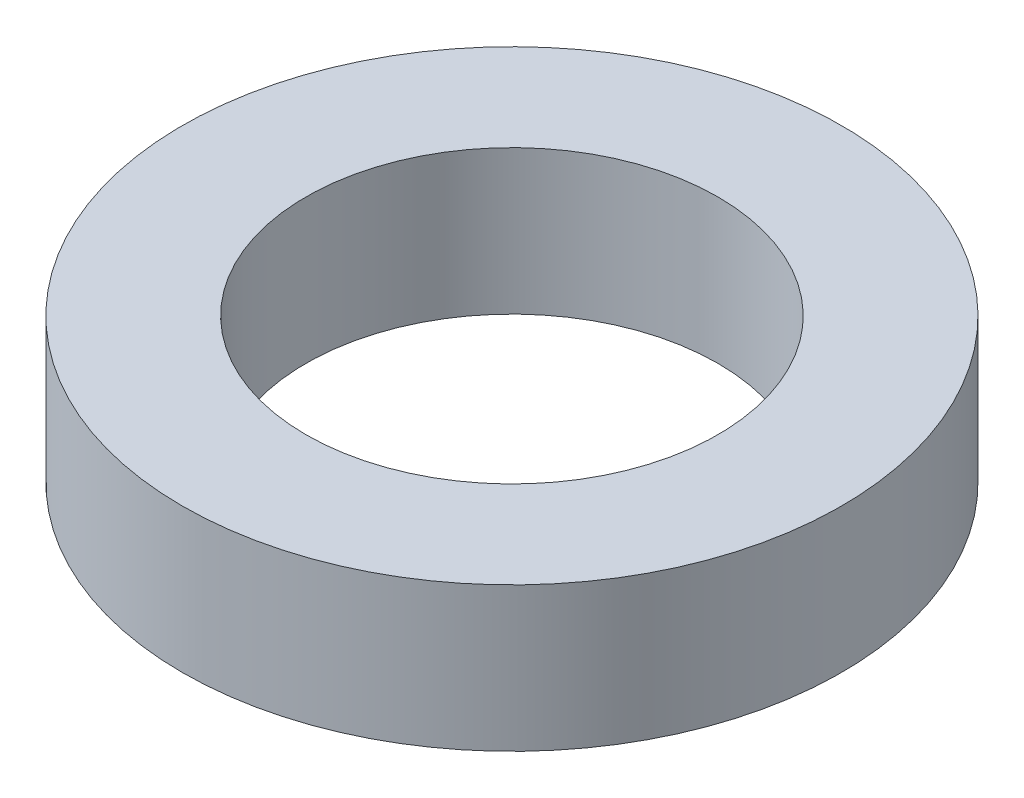
ISO-10303-21;
HEADER;
FILE_DESCRIPTION(('STEP AP214'),'2;1');
FILE_NAME('part.step','',(''),(''),'','','');
FILE_SCHEMA(('AUTOMOTIVE_DESIGN { 1 0 10303 214 1 1 1 1 }'));
ENDSEC;
DATA;
#1=APPLICATION_CONTEXT('core data for automotive mechanical design processes');
#2=APPLICATION_PROTOCOL_DEFINITION('international standard','automotive_design',2000,#1);
#3=PRODUCT_CONTEXT('',#1,'mechanical');
#4=PRODUCT('Part','Part','',(#3));
#5=PRODUCT_RELATED_PRODUCT_CATEGORY('part','',(#4));
#6=PRODUCT_DEFINITION_FORMATION('','',#4);
#7=PRODUCT_DEFINITION_CONTEXT('part definition',#1,'design');
#8=PRODUCT_DEFINITION('design','',#6,#7);
#9=PRODUCT_DEFINITION_SHAPE('','',#8);
#10=(LENGTH_UNIT() NAMED_UNIT(*) SI_UNIT(.MILLI.,.METRE.));
#11=(NAMED_UNIT(*) PLANE_ANGLE_UNIT() SI_UNIT($,.RADIAN.));
#12=(NAMED_UNIT(*) SI_UNIT($,.STERADIAN.) SOLID_ANGLE_UNIT());
#13=UNCERTAINTY_MEASURE_WITH_UNIT(LENGTH_MEASURE(1.E-05),#10,'distance_accuracy_value','');
#14=(GEOMETRIC_REPRESENTATION_CONTEXT(3) GLOBAL_UNCERTAINTY_ASSIGNED_CONTEXT((#13)) GLOBAL_UNIT_ASSIGNED_CONTEXT((#10,
#11,#12)) REPRESENTATION_CONTEXT('',''));
#15=CARTESIAN_POINT('',(0.,0.,0.));
#16=DIRECTION('',(0.,0.,1.));
#17=DIRECTION('',(1.,0.,0.));
#18=AXIS2_PLACEMENT_3D('',#15,#16,#17);
#19=CARTESIAN_POINT('',(0.,3.5,0.));
#20=DIRECTION('',(0.,1.,0.));
#21=DIRECTION('',(0.,0.,1.));
#22=AXIS2_PLACEMENT_3D('',#19,#20,#21);
#23=PLANE('',#22);
#24=CARTESIAN_POINT('',(0.,3.5,0.));
#25=DIRECTION('',(0.,1.,0.));
#26=DIRECTION('',(0.,0.,1.));
#27=AXIS2_PLACEMENT_3D('',#24,#25,#26);
#28=CIRCLE('',#27,16.);
#29=CARTESIAN_POINT('',(0.,3.5,16.));
#30=VERTEX_POINT('',#29);
#31=EDGE_CURVE('E10',#30,#30,#28,.T.);
#32=ORIENTED_EDGE('',*,*,#31,.T.);
#33=EDGE_LOOP('',(#32));
#34=FACE_BOUND('',#33,.T.);
#35=CARTESIAN_POINT('',(0.,3.5,0.));
#36=DIRECTION('',(0.,1.,0.));
#37=DIRECTION('',(0.,0.,1.));
#38=AXIS2_PLACEMENT_3D('',#35,#36,#37);
#39=CIRCLE('',#38,10.);
#40=CARTESIAN_POINT('',(0.,3.5,10.));
#41=VERTEX_POINT('',#40);
#42=EDGE_CURVE('E54',#41,#41,#39,.T.);
#43=ORIENTED_EDGE('',*,*,#42,.F.);
#44=EDGE_LOOP('',(#43));
#45=FACE_BOUND('',#44,.T.);
#46=ADVANCED_FACE('F43',(#34,#45),#23,.T.);
#47=CARTESIAN_POINT('',(0.,-3.5,0.));
#48=DIRECTION('',(0.,1.,0.));
#49=DIRECTION('',(0.,0.,1.));
#50=AXIS2_PLACEMENT_3D('',#47,#48,#49);
#51=PLANE('',#50);
#52=CARTESIAN_POINT('',(0.,-3.5,0.));
#53=DIRECTION('',(0.,1.,0.));
#54=DIRECTION('',(0.,0.,1.));
#55=AXIS2_PLACEMENT_3D('',#52,#53,#54);
#56=CIRCLE('',#55,16.);
#57=CARTESIAN_POINT('',(0.,-3.5,16.));
#58=VERTEX_POINT('',#57);
#59=EDGE_CURVE('E47',#58,#58,#56,.T.);
#60=ORIENTED_EDGE('',*,*,#59,.F.);
#61=EDGE_LOOP('',(#60));
#62=FACE_BOUND('',#61,.T.);
#63=CARTESIAN_POINT('',(0.,-3.5,0.));
#64=DIRECTION('',(0.,1.,0.));
#65=DIRECTION('',(0.,0.,1.));
#66=AXIS2_PLACEMENT_3D('',#63,#64,#65);
#67=CIRCLE('',#66,10.);
#68=CARTESIAN_POINT('',(0.,-3.5,10.));
#69=VERTEX_POINT('',#68);
#70=EDGE_CURVE('E56',#69,#69,#67,.T.);
#71=ORIENTED_EDGE('',*,*,#70,.T.);
#72=EDGE_LOOP('',(#71));
#73=FACE_BOUND('',#72,.T.);
#74=ADVANCED_FACE('F66',(#62,#73),#51,.F.);
#75=CARTESIAN_POINT('',(0.,3.5,0.));
#76=DIRECTION('',(0.,-1.,0.));
#77=DIRECTION('',(0.,0.,-1.));
#78=AXIS2_PLACEMENT_3D('',#75,#76,#77);
#79=CYLINDRICAL_SURFACE('',#78,16.);
#80=ORIENTED_EDGE('',*,*,#31,.F.);
#81=EDGE_LOOP('',(#80));
#82=FACE_BOUND('',#81,.T.);
#83=ORIENTED_EDGE('',*,*,#59,.T.);
#84=EDGE_LOOP('',(#83));
#85=FACE_BOUND('',#84,.T.);
#86=ADVANCED_FACE('F45',(#82,#85),#79,.T.);
#87=CARTESIAN_POINT('',(0.,3.5,0.));
#88=DIRECTION('',(0.,-1.,0.));
#89=DIRECTION('',(0.,0.,-1.));
#90=AXIS2_PLACEMENT_3D('',#87,#88,#89);
#91=CYLINDRICAL_SURFACE('',#90,10.);
#92=ORIENTED_EDGE('',*,*,#42,.T.);
#93=EDGE_LOOP('',(#92));
#94=FACE_BOUND('',#93,.T.);
#95=ORIENTED_EDGE('',*,*,#70,.F.);
#96=EDGE_LOOP('',(#95));
#97=FACE_BOUND('',#96,.T.);
#98=ADVANCED_FACE('F62',(#94,#97),#91,.F.);
#99=CLOSED_SHELL('',(#46,#74,#86,#98));
#100=MANIFOLD_SOLID_BREP('B2',#99);
#101=ADVANCED_BREP_SHAPE_REPRESENTATION('',(#18,#100),#14);
#102=SHAPE_DEFINITION_REPRESENTATION(#9,#101);
ENDSEC;
END-ISO-10303-21;
